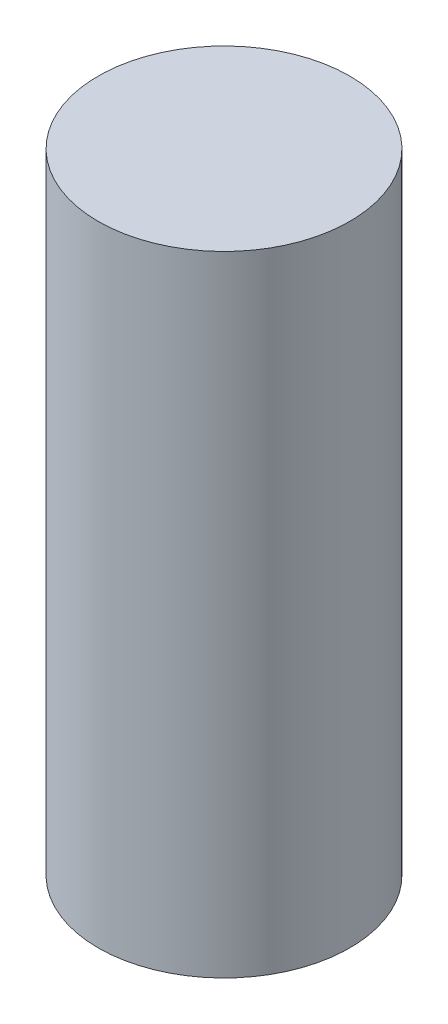
ISO-10303-21;
HEADER;
FILE_DESCRIPTION(('STEP AP214'),'2;1');
FILE_NAME('part.step','',(''),(''),'','','');
FILE_SCHEMA(('AUTOMOTIVE_DESIGN { 1 0 10303 214 1 1 1 1 }'));
ENDSEC;
DATA;
#1=APPLICATION_CONTEXT('core data for automotive mechanical design processes');
#2=APPLICATION_PROTOCOL_DEFINITION('international standard','automotive_design',2000,#1);
#3=PRODUCT_CONTEXT('',#1,'mechanical');
#4=PRODUCT('Part','Part','',(#3));
#5=PRODUCT_RELATED_PRODUCT_CATEGORY('part','',(#4));
#6=PRODUCT_DEFINITION_FORMATION('','',#4);
#7=PRODUCT_DEFINITION_CONTEXT('part definition',#1,'design');
#8=PRODUCT_DEFINITION('design','',#6,#7);
#9=PRODUCT_DEFINITION_SHAPE('','',#8);
#10=(LENGTH_UNIT() NAMED_UNIT(*) SI_UNIT(.MILLI.,.METRE.));
#11=(NAMED_UNIT(*) PLANE_ANGLE_UNIT() SI_UNIT($,.RADIAN.));
#12=(NAMED_UNIT(*) SI_UNIT($,.STERADIAN.) SOLID_ANGLE_UNIT());
#13=UNCERTAINTY_MEASURE_WITH_UNIT(LENGTH_MEASURE(1.E-05),#10,'distance_accuracy_value','');
#14=(GEOMETRIC_REPRESENTATION_CONTEXT(3) GLOBAL_UNCERTAINTY_ASSIGNED_CONTEXT((#13)) GLOBAL_UNIT_ASSIGNED_CONTEXT((#10,
#11,#12)) REPRESENTATION_CONTEXT('',''));
#15=CARTESIAN_POINT('',(0.,0.,0.));
#16=DIRECTION('',(0.,0.,1.));
#17=DIRECTION('',(1.,0.,0.));
#18=AXIS2_PLACEMENT_3D('',#15,#16,#17);
#19=CARTESIAN_POINT('',(0.,100.,0.));
#20=DIRECTION('',(0.,-1.,0.));
#21=DIRECTION('',(0.,0.,-1.));
#22=AXIS2_PLACEMENT_3D('',#19,#20,#21);
#23=CYLINDRICAL_SURFACE('',#22,20.);
#24=CARTESIAN_POINT('',(0.,100.,0.));
#25=DIRECTION('',(0.,1.,0.));
#26=DIRECTION('',(0.,0.,1.));
#27=AXIS2_PLACEMENT_3D('',#24,#25,#26);
#28=CIRCLE('',#27,20.);
#29=CARTESIAN_POINT('',(0.,100.,20.));
#30=VERTEX_POINT('',#29);
#31=EDGE_CURVE('E10',#30,#30,#28,.T.);
#32=ORIENTED_EDGE('',*,*,#31,.F.);
#33=EDGE_LOOP('',(#32));
#34=FACE_BOUND('',#33,.T.);
#35=CARTESIAN_POINT('',(0.,0.,0.));
#36=DIRECTION('',(0.,1.,0.));
#37=DIRECTION('',(0.,0.,1.));
#38=AXIS2_PLACEMENT_3D('',#35,#36,#37);
#39=CIRCLE('',#38,20.);
#40=CARTESIAN_POINT('',(0.,0.,20.));
#41=VERTEX_POINT('',#40);
#42=EDGE_CURVE('E34',#41,#41,#39,.T.);
#43=ORIENTED_EDGE('',*,*,#42,.T.);
#44=EDGE_LOOP('',(#43));
#45=FACE_BOUND('',#44,.T.);
#46=ADVANCED_FACE('F31',(#34,#45),#23,.T.);
#47=CARTESIAN_POINT('',(0.,100.,0.));
#48=DIRECTION('',(0.,1.,0.));
#49=DIRECTION('',(0.,0.,1.));
#50=AXIS2_PLACEMENT_3D('',#47,#48,#49);
#51=PLANE('',#50);
#52=ORIENTED_EDGE('',*,*,#31,.T.);
#53=EDGE_LOOP('',(#52));
#54=FACE_BOUND('',#53,.T.);
#55=ADVANCED_FACE('F46',(#54),#51,.T.);
#56=CARTESIAN_POINT('',(0.,0.,0.));
#57=DIRECTION('',(0.,1.,0.));
#58=DIRECTION('',(0.,0.,1.));
#59=AXIS2_PLACEMENT_3D('',#56,#57,#58);
#60=PLANE('',#59);
#61=ORIENTED_EDGE('',*,*,#42,.F.);
#62=EDGE_LOOP('',(#61));
#63=FACE_BOUND('',#62,.T.);
#64=ADVANCED_FACE('F44',(#63),#60,.F.);
#65=CLOSED_SHELL('',(#46,#55,#64));
#66=MANIFOLD_SOLID_BREP('B2',#65);
#67=ADVANCED_BREP_SHAPE_REPRESENTATION('',(#18,#66),#14);
#68=SHAPE_DEFINITION_REPRESENTATION(#9,#67);
ENDSEC;
END-ISO-10303-21;
